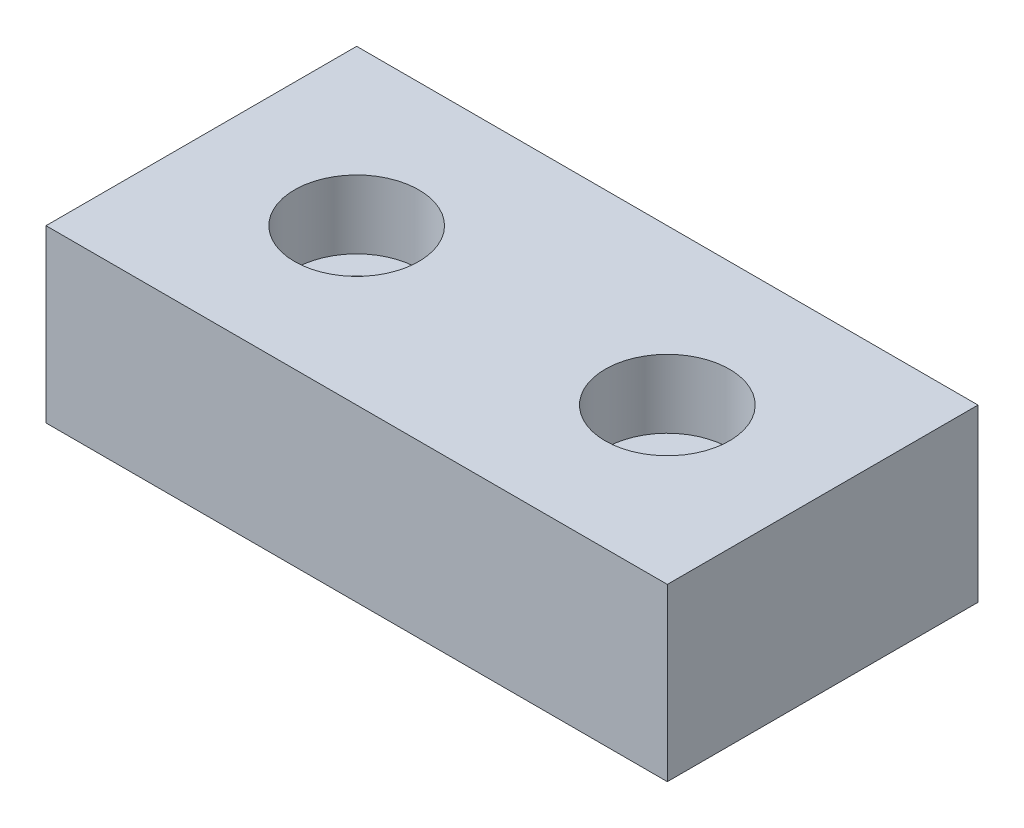
ISO-10303-21;
HEADER;
FILE_DESCRIPTION(('STEP AP214'),'2;1');
FILE_NAME('part.step','',(''),(''),'','','');
FILE_SCHEMA(('AUTOMOTIVE_DESIGN { 1 0 10303 214 1 1 1 1 }'));
ENDSEC;
DATA;
#1=APPLICATION_CONTEXT('core data for automotive mechanical design processes');
#2=APPLICATION_PROTOCOL_DEFINITION('international standard','automotive_design',2000,#1);
#3=PRODUCT_CONTEXT('',#1,'mechanical');
#4=PRODUCT('Part','Part','',(#3));
#5=PRODUCT_RELATED_PRODUCT_CATEGORY('part','',(#4));
#6=PRODUCT_DEFINITION_FORMATION('','',#4);
#7=PRODUCT_DEFINITION_CONTEXT('part definition',#1,'design');
#8=PRODUCT_DEFINITION('design','',#6,#7);
#9=PRODUCT_DEFINITION_SHAPE('','',#8);
#10=(LENGTH_UNIT() NAMED_UNIT(*) SI_UNIT(.MILLI.,.METRE.));
#11=(NAMED_UNIT(*) PLANE_ANGLE_UNIT() SI_UNIT($,.RADIAN.));
#12=(NAMED_UNIT(*) SI_UNIT($,.STERADIAN.) SOLID_ANGLE_UNIT());
#13=UNCERTAINTY_MEASURE_WITH_UNIT(LENGTH_MEASURE(1.E-05),#10,'distance_accuracy_value','');
#14=(GEOMETRIC_REPRESENTATION_CONTEXT(3) GLOBAL_UNCERTAINTY_ASSIGNED_CONTEXT((#13)) GLOBAL_UNIT_ASSIGNED_CONTEXT((#10,
#11,#12)) REPRESENTATION_CONTEXT('',''));
#15=CARTESIAN_POINT('',(0.,0.,0.));
#16=DIRECTION('',(0.,0.,1.));
#17=DIRECTION('',(1.,0.,0.));
#18=AXIS2_PLACEMENT_3D('',#15,#16,#17);
#19=CARTESIAN_POINT('',(0.,11.,0.));
#20=DIRECTION('',(1.,0.,0.));
#21=DIRECTION('',(0.,0.,-1.));
#22=AXIS2_PLACEMENT_3D('',#19,#20,#21);
#23=PLANE('',#22);
#24=DIRECTION('',(0.,0.,1.));
#25=VECTOR('',#24,1.);
#26=CARTESIAN_POINT('',(0.,0.,0.));
#27=LINE('',#26,#25);
#28=CARTESIAN_POINT('',(0.,0.,-20.));
#29=VERTEX_POINT('',#28);
#30=CARTESIAN_POINT('',(0.,0.,0.));
#31=VERTEX_POINT('',#30);
#32=EDGE_CURVE('E96',#29,#31,#27,.T.);
#33=ORIENTED_EDGE('',*,*,#32,.T.);
#34=DIRECTION('',(0.,-1.,0.));
#35=VECTOR('',#34,1.);
#36=CARTESIAN_POINT('',(0.,11.,0.));
#37=LINE('',#36,#35);
#38=CARTESIAN_POINT('',(0.,11.,0.));
#39=VERTEX_POINT('',#38);
#40=EDGE_CURVE('E11',#39,#31,#37,.T.);
#41=ORIENTED_EDGE('',*,*,#40,.F.);
#42=DIRECTION('',(0.,0.,1.));
#43=VECTOR('',#42,1.);
#44=CARTESIAN_POINT('',(0.,11.,0.));
#45=LINE('',#44,#43);
#46=CARTESIAN_POINT('',(0.,11.,-20.));
#47=VERTEX_POINT('',#46);
#48=EDGE_CURVE('E84',#47,#39,#45,.T.);
#49=ORIENTED_EDGE('',*,*,#48,.F.);
#50=DIRECTION('',(0.,-1.,0.));
#51=VECTOR('',#50,1.);
#52=CARTESIAN_POINT('',(0.,11.,-20.));
#53=LINE('',#52,#51);
#54=EDGE_CURVE('E92',#47,#29,#53,.T.);
#55=ORIENTED_EDGE('',*,*,#54,.T.);
#56=EDGE_LOOP('',(#33,#41,#49,#55));
#57=FACE_BOUND('',#56,.T.);
#58=ADVANCED_FACE('F33',(#57),#23,.F.);
#59=CARTESIAN_POINT('',(0.,11.,0.));
#60=DIRECTION('',(0.,0.,-1.));
#61=DIRECTION('',(-1.,0.,0.));
#62=AXIS2_PLACEMENT_3D('',#59,#60,#61);
#63=PLANE('',#62);
#64=DIRECTION('',(1.,0.,0.));
#65=VECTOR('',#64,1.);
#66=CARTESIAN_POINT('',(0.,0.,0.));
#67=LINE('',#66,#65);
#68=CARTESIAN_POINT('',(40.,0.,0.));
#69=VERTEX_POINT('',#68);
#70=EDGE_CURVE('E88',#31,#69,#67,.T.);
#71=ORIENTED_EDGE('',*,*,#70,.T.);
#72=DIRECTION('',(0.,-1.,0.));
#73=VECTOR('',#72,1.);
#74=CARTESIAN_POINT('',(40.,11.,0.));
#75=LINE('',#74,#73);
#76=CARTESIAN_POINT('',(40.,11.,0.));
#77=VERTEX_POINT('',#76);
#78=EDGE_CURVE('E41',#77,#69,#75,.T.);
#79=ORIENTED_EDGE('',*,*,#78,.F.);
#80=DIRECTION('',(1.,0.,0.));
#81=VECTOR('',#80,1.);
#82=CARTESIAN_POINT('',(0.,11.,0.));
#83=LINE('',#82,#81);
#84=EDGE_CURVE('E79',#39,#77,#83,.T.);
#85=ORIENTED_EDGE('',*,*,#84,.F.);
#86=ORIENTED_EDGE('',*,*,#40,.T.);
#87=EDGE_LOOP('',(#71,#79,#85,#86));
#88=FACE_BOUND('',#87,.T.);
#89=ADVANCED_FACE('F87',(#88),#63,.F.);
#90=CARTESIAN_POINT('',(40.,11.,0.));
#91=DIRECTION('',(-1.,0.,0.));
#92=DIRECTION('',(0.,0.,1.));
#93=AXIS2_PLACEMENT_3D('',#90,#91,#92);
#94=PLANE('',#93);
#95=DIRECTION('',(0.,0.,-1.));
#96=VECTOR('',#95,1.);
#97=CARTESIAN_POINT('',(40.,0.,0.));
#98=LINE('',#97,#96);
#99=CARTESIAN_POINT('',(40.,0.,-20.));
#100=VERTEX_POINT('',#99);
#101=EDGE_CURVE('E66',#69,#100,#98,.T.);
#102=ORIENTED_EDGE('',*,*,#101,.T.);
#103=DIRECTION('',(0.,-1.,0.));
#104=VECTOR('',#103,1.);
#105=CARTESIAN_POINT('',(40.,11.,-20.));
#106=LINE('',#105,#104);
#107=CARTESIAN_POINT('',(40.,11.,-20.));
#108=VERTEX_POINT('',#107);
#109=EDGE_CURVE('E89',#108,#100,#106,.T.);
#110=ORIENTED_EDGE('',*,*,#109,.F.);
#111=DIRECTION('',(0.,0.,-1.));
#112=VECTOR('',#111,1.);
#113=CARTESIAN_POINT('',(40.,11.,0.));
#114=LINE('',#113,#112);
#115=EDGE_CURVE('E82',#77,#108,#114,.T.);
#116=ORIENTED_EDGE('',*,*,#115,.F.);
#117=ORIENTED_EDGE('',*,*,#78,.T.);
#118=EDGE_LOOP('',(#102,#110,#116,#117));
#119=FACE_BOUND('',#118,.T.);
#120=ADVANCED_FACE('F90',(#119),#94,.F.);
#121=CARTESIAN_POINT('',(0.,11.,-20.));
#122=DIRECTION('',(0.,0.,1.));
#123=DIRECTION('',(1.,0.,0.));
#124=AXIS2_PLACEMENT_3D('',#121,#122,#123);
#125=PLANE('',#124);
#126=DIRECTION('',(-1.,0.,0.));
#127=VECTOR('',#126,1.);
#128=CARTESIAN_POINT('',(0.,0.,-20.));
#129=LINE('',#128,#127);
#130=EDGE_CURVE('E72',#100,#29,#129,.T.);
#131=ORIENTED_EDGE('',*,*,#130,.T.);
#132=ORIENTED_EDGE('',*,*,#54,.F.);
#133=DIRECTION('',(-1.,0.,0.));
#134=VECTOR('',#133,1.);
#135=CARTESIAN_POINT('',(0.,11.,-20.));
#136=LINE('',#135,#134);
#137=EDGE_CURVE('E49',#108,#47,#136,.T.);
#138=ORIENTED_EDGE('',*,*,#137,.F.);
#139=ORIENTED_EDGE('',*,*,#109,.T.);
#140=EDGE_LOOP('',(#131,#132,#138,#139));
#141=FACE_BOUND('',#140,.T.);
#142=ADVANCED_FACE('F104',(#141),#125,.F.);
#143=CARTESIAN_POINT('',(0.,11.,0.));
#144=DIRECTION('',(0.,-1.,0.));
#145=DIRECTION('',(0.,0.,-1.));
#146=AXIS2_PLACEMENT_3D('',#143,#144,#145);
#147=PLANE('',#146);
#148=CARTESIAN_POINT('',(10.,11.,-10.));
#149=DIRECTION('',(0.,1.,0.));
#150=DIRECTION('',(0.,0.,1.));
#151=AXIS2_PLACEMENT_3D('',#148,#149,#150);
#152=CIRCLE('',#151,4.);
#153=CARTESIAN_POINT('',(10.,11.,-6.));
#154=VERTEX_POINT('',#153);
#155=EDGE_CURVE('E130',#154,#154,#152,.T.);
#156=ORIENTED_EDGE('',*,*,#155,.F.);
#157=EDGE_LOOP('',(#156));
#158=FACE_BOUND('',#157,.T.);
#159=CARTESIAN_POINT('',(30.,11.,-10.));
#160=DIRECTION('',(0.,1.,0.));
#161=DIRECTION('',(0.,0.,1.));
#162=AXIS2_PLACEMENT_3D('',#159,#160,#161);
#163=CIRCLE('',#162,4.);
#164=CARTESIAN_POINT('',(30.,11.,-6.));
#165=VERTEX_POINT('',#164);
#166=EDGE_CURVE('E118',#165,#165,#163,.T.);
#167=ORIENTED_EDGE('',*,*,#166,.F.);
#168=EDGE_LOOP('',(#167));
#169=FACE_BOUND('',#168,.T.);
#170=ORIENTED_EDGE('',*,*,#48,.T.);
#171=ORIENTED_EDGE('',*,*,#84,.T.);
#172=ORIENTED_EDGE('',*,*,#115,.T.);
#173=ORIENTED_EDGE('',*,*,#137,.T.);
#174=EDGE_LOOP('',(#170,#171,#172,#173));
#175=FACE_BOUND('',#174,.T.);
#176=ADVANCED_FACE('F80',(#158,#169,#175),#147,.F.);
#177=CARTESIAN_POINT('',(0.,0.,0.));
#178=DIRECTION('',(0.,-1.,0.));
#179=DIRECTION('',(0.,0.,-1.));
#180=AXIS2_PLACEMENT_3D('',#177,#178,#179);
#181=PLANE('',#180);
#182=CARTESIAN_POINT('',(10.,0.,-10.));
#183=DIRECTION('',(0.,1.,0.));
#184=DIRECTION('',(0.,0.,1.));
#185=AXIS2_PLACEMENT_3D('',#182,#183,#184);
#186=CIRCLE('',#185,2.25);
#187=CARTESIAN_POINT('',(10.,0.,-7.75));
#188=VERTEX_POINT('',#187);
#189=EDGE_CURVE('E121',#188,#188,#186,.T.);
#190=ORIENTED_EDGE('',*,*,#189,.T.);
#191=EDGE_LOOP('',(#190));
#192=FACE_BOUND('',#191,.T.);
#193=CARTESIAN_POINT('',(30.,0.,-10.));
#194=DIRECTION('',(0.,1.,0.));
#195=DIRECTION('',(0.,0.,1.));
#196=AXIS2_PLACEMENT_3D('',#193,#194,#195);
#197=CIRCLE('',#196,2.25);
#198=CARTESIAN_POINT('',(30.,0.,-7.75000000000001));
#199=VERTEX_POINT('',#198);
#200=EDGE_CURVE('E99',#199,#199,#197,.T.);
#201=ORIENTED_EDGE('',*,*,#200,.T.);
#202=EDGE_LOOP('',(#201));
#203=FACE_BOUND('',#202,.T.);
#204=ORIENTED_EDGE('',*,*,#32,.F.);
#205=ORIENTED_EDGE('',*,*,#130,.F.);
#206=ORIENTED_EDGE('',*,*,#101,.F.);
#207=ORIENTED_EDGE('',*,*,#70,.F.);
#208=EDGE_LOOP('',(#204,#205,#206,#207));
#209=FACE_BOUND('',#208,.T.);
#210=ADVANCED_FACE('F107',(#192,#203,#209),#181,.T.);
#211=CARTESIAN_POINT('',(30.,11.,-10.));
#212=DIRECTION('',(0.,1.,0.));
#213=DIRECTION('',(0.,0.,1.));
#214=AXIS2_PLACEMENT_3D('',#211,#212,#213);
#215=CYLINDRICAL_SURFACE('',#214,2.25);
#216=ORIENTED_EDGE('',*,*,#200,.F.);
#217=EDGE_LOOP('',(#216));
#218=FACE_BOUND('',#217,.T.);
#219=CARTESIAN_POINT('',(30.,6.6,-10.));
#220=DIRECTION('',(0.,1.,0.));
#221=DIRECTION('',(0.,0.,1.));
#222=AXIS2_PLACEMENT_3D('',#219,#220,#221);
#223=CIRCLE('',#222,2.25);
#224=CARTESIAN_POINT('',(30.,6.6,-7.75));
#225=VERTEX_POINT('',#224);
#226=EDGE_CURVE('E112',#225,#225,#223,.T.);
#227=ORIENTED_EDGE('',*,*,#226,.T.);
#228=EDGE_LOOP('',(#227));
#229=FACE_BOUND('',#228,.T.);
#230=ADVANCED_FACE('F154',(#218,#229),#215,.F.);
#231=CARTESIAN_POINT('',(32.25,6.6,-10.));
#232=DIRECTION('',(0.,-1.,0.));
#233=DIRECTION('',(0.,0.,-1.));
#234=AXIS2_PLACEMENT_3D('',#231,#232,#233);
#235=PLANE('',#234);
#236=ORIENTED_EDGE('',*,*,#226,.F.);
#237=EDGE_LOOP('',(#236));
#238=FACE_BOUND('',#237,.T.);
#239=CARTESIAN_POINT('',(30.,6.6,-10.));
#240=DIRECTION('',(0.,1.,0.));
#241=DIRECTION('',(0.,0.,1.));
#242=AXIS2_PLACEMENT_3D('',#239,#240,#241);
#243=CIRCLE('',#242,4.);
#244=CARTESIAN_POINT('',(30.,6.6,-6.));
#245=VERTEX_POINT('',#244);
#246=EDGE_CURVE('E115',#245,#245,#243,.T.);
#247=ORIENTED_EDGE('',*,*,#246,.T.);
#248=EDGE_LOOP('',(#247));
#249=FACE_BOUND('',#248,.T.);
#250=ADVANCED_FACE('F144',(#238,#249),#235,.F.);
#251=CARTESIAN_POINT('',(30.,11.,-10.));
#252=DIRECTION('',(0.,1.,0.));
#253=DIRECTION('',(0.,0.,1.));
#254=AXIS2_PLACEMENT_3D('',#251,#252,#253);
#255=CYLINDRICAL_SURFACE('',#254,4.);
#256=ORIENTED_EDGE('',*,*,#246,.F.);
#257=EDGE_LOOP('',(#256));
#258=FACE_BOUND('',#257,.T.);
#259=ORIENTED_EDGE('',*,*,#166,.T.);
#260=EDGE_LOOP('',(#259));
#261=FACE_BOUND('',#260,.T.);
#262=ADVANCED_FACE('F141',(#258,#261),#255,.F.);
#263=CARTESIAN_POINT('',(10.,11.,-10.));
#264=DIRECTION('',(0.,1.,0.));
#265=DIRECTION('',(0.,0.,1.));
#266=AXIS2_PLACEMENT_3D('',#263,#264,#265);
#267=CYLINDRICAL_SURFACE('',#266,2.25);
#268=ORIENTED_EDGE('',*,*,#189,.F.);
#269=EDGE_LOOP('',(#268));
#270=FACE_BOUND('',#269,.T.);
#271=CARTESIAN_POINT('',(10.,6.6,-10.));
#272=DIRECTION('',(0.,1.,0.));
#273=DIRECTION('',(0.,0.,1.));
#274=AXIS2_PLACEMENT_3D('',#271,#272,#273);
#275=CIRCLE('',#274,2.25);
#276=CARTESIAN_POINT('',(10.,6.6,-7.75));
#277=VERTEX_POINT('',#276);
#278=EDGE_CURVE('E124',#277,#277,#275,.T.);
#279=ORIENTED_EDGE('',*,*,#278,.T.);
#280=EDGE_LOOP('',(#279));
#281=FACE_BOUND('',#280,.T.);
#282=ADVANCED_FACE('F143',(#270,#281),#267,.F.);
#283=CARTESIAN_POINT('',(12.25,6.6,-10.));
#284=DIRECTION('',(0.,-1.,0.));
#285=DIRECTION('',(0.,0.,-1.));
#286=AXIS2_PLACEMENT_3D('',#283,#284,#285);
#287=PLANE('',#286);
#288=ORIENTED_EDGE('',*,*,#278,.F.);
#289=EDGE_LOOP('',(#288));
#290=FACE_BOUND('',#289,.T.);
#291=CARTESIAN_POINT('',(10.,6.6,-10.));
#292=DIRECTION('',(0.,1.,0.));
#293=DIRECTION('',(0.,0.,1.));
#294=AXIS2_PLACEMENT_3D('',#291,#292,#293);
#295=CIRCLE('',#294,4.);
#296=CARTESIAN_POINT('',(10.,6.6,-6.));
#297=VERTEX_POINT('',#296);
#298=EDGE_CURVE('E127',#297,#297,#295,.T.);
#299=ORIENTED_EDGE('',*,*,#298,.T.);
#300=EDGE_LOOP('',(#299));
#301=FACE_BOUND('',#300,.T.);
#302=ADVANCED_FACE('F151',(#290,#301),#287,.F.);
#303=CARTESIAN_POINT('',(10.,11.,-10.));
#304=DIRECTION('',(0.,1.,0.));
#305=DIRECTION('',(0.,0.,1.));
#306=AXIS2_PLACEMENT_3D('',#303,#304,#305);
#307=CYLINDRICAL_SURFACE('',#306,4.);
#308=ORIENTED_EDGE('',*,*,#298,.F.);
#309=EDGE_LOOP('',(#308));
#310=FACE_BOUND('',#309,.T.);
#311=ORIENTED_EDGE('',*,*,#155,.T.);
#312=EDGE_LOOP('',(#311));
#313=FACE_BOUND('',#312,.T.);
#314=ADVANCED_FACE('F134',(#310,#313),#307,.F.);
#315=CLOSED_SHELL('',(#58,#89,#120,#142,#176,#210,#230,#250,#262,#282,#302,#314));
#316=MANIFOLD_SOLID_BREP('B2',#315);
#317=ADVANCED_BREP_SHAPE_REPRESENTATION('',(#18,#316),#14);
#318=SHAPE_DEFINITION_REPRESENTATION(#9,#317);
ENDSEC;
END-ISO-10303-21;
